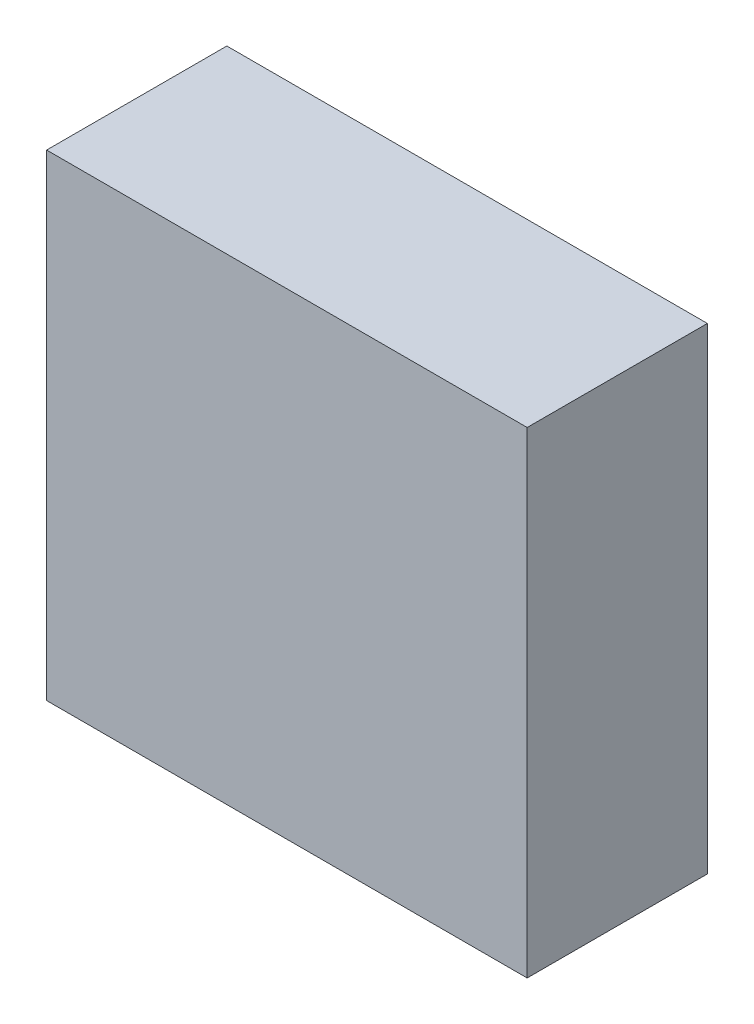
ISO-10303-21;
HEADER;
FILE_DESCRIPTION(('STEP AP214'),'2;1');
FILE_NAME('part.step','',(''),(''),'','','');
FILE_SCHEMA(('AUTOMOTIVE_DESIGN { 1 0 10303 214 1 1 1 1 }'));
ENDSEC;
DATA;
#1=APPLICATION_CONTEXT('core data for automotive mechanical design processes');
#2=APPLICATION_PROTOCOL_DEFINITION('international standard','automotive_design',2000,#1);
#3=PRODUCT_CONTEXT('',#1,'mechanical');
#4=PRODUCT('Part','Part','',(#3));
#5=PRODUCT_RELATED_PRODUCT_CATEGORY('part','',(#4));
#6=PRODUCT_DEFINITION_FORMATION('','',#4);
#7=PRODUCT_DEFINITION_CONTEXT('part definition',#1,'design');
#8=PRODUCT_DEFINITION('design','',#6,#7);
#9=PRODUCT_DEFINITION_SHAPE('','',#8);
#10=(LENGTH_UNIT() NAMED_UNIT(*) SI_UNIT(.MILLI.,.METRE.));
#11=(NAMED_UNIT(*) PLANE_ANGLE_UNIT() SI_UNIT($,.RADIAN.));
#12=(NAMED_UNIT(*) SI_UNIT($,.STERADIAN.) SOLID_ANGLE_UNIT());
#13=UNCERTAINTY_MEASURE_WITH_UNIT(LENGTH_MEASURE(1.E-05),#10,'distance_accuracy_value','');
#14=(GEOMETRIC_REPRESENTATION_CONTEXT(3) GLOBAL_UNCERTAINTY_ASSIGNED_CONTEXT((#13)) GLOBAL_UNIT_ASSIGNED_CONTEXT((#10,
#11,#12)) REPRESENTATION_CONTEXT('',''));
#15=CARTESIAN_POINT('',(0.,0.,0.));
#16=DIRECTION('',(0.,0.,1.));
#17=DIRECTION('',(1.,0.,0.));
#18=AXIS2_PLACEMENT_3D('',#15,#16,#17);
#19=CARTESIAN_POINT('',(64.,63.5,48.));
#20=DIRECTION('',(-1.,0.,0.));
#21=DIRECTION('',(0.,-1.,0.));
#22=AXIS2_PLACEMENT_3D('',#19,#20,#21);
#23=PLANE('',#22);
#24=DIRECTION('',(0.,1.,0.));
#25=VECTOR('',#24,1.);
#26=CARTESIAN_POINT('',(64.,63.5,0.));
#27=LINE('',#26,#25);
#28=CARTESIAN_POINT('',(64.,-63.5,0.));
#29=VERTEX_POINT('',#28);
#30=CARTESIAN_POINT('',(64.,63.5,0.));
#31=VERTEX_POINT('',#30);
#32=EDGE_CURVE('E111',#29,#31,#27,.T.);
#33=ORIENTED_EDGE('',*,*,#32,.T.);
#34=DIRECTION('',(0.,0.,-1.));
#35=VECTOR('',#34,1.);
#36=CARTESIAN_POINT('',(64.,63.5,48.));
#37=LINE('',#36,#35);
#38=CARTESIAN_POINT('',(64.,63.5,48.));
#39=VERTEX_POINT('',#38);
#40=EDGE_CURVE('E11',#39,#31,#37,.T.);
#41=ORIENTED_EDGE('',*,*,#40,.F.);
#42=DIRECTION('',(0.,1.,0.));
#43=VECTOR('',#42,1.);
#44=CARTESIAN_POINT('',(64.,63.5,48.));
#45=LINE('',#44,#43);
#46=CARTESIAN_POINT('',(64.,-63.5,48.));
#47=VERTEX_POINT('',#46);
#48=EDGE_CURVE('E95',#47,#39,#45,.T.);
#49=ORIENTED_EDGE('',*,*,#48,.F.);
#50=DIRECTION('',(0.,0.,-1.));
#51=VECTOR('',#50,1.);
#52=CARTESIAN_POINT('',(64.,-63.5,48.));
#53=LINE('',#52,#51);
#54=EDGE_CURVE('E107',#47,#29,#53,.T.);
#55=ORIENTED_EDGE('',*,*,#54,.T.);
#56=EDGE_LOOP('',(#33,#41,#49,#55));
#57=FACE_BOUND('',#56,.T.);
#58=ADVANCED_FACE('F43',(#57),#23,.F.);
#59=CARTESIAN_POINT('',(-64.,63.5,48.));
#60=DIRECTION('',(0.,-1.,0.));
#61=DIRECTION('',(0.,0.,-1.));
#62=AXIS2_PLACEMENT_3D('',#59,#60,#61);
#63=PLANE('',#62);
#64=DIRECTION('',(-1.,0.,0.));
#65=VECTOR('',#64,1.);
#66=CARTESIAN_POINT('',(-64.,63.5,0.));
#67=LINE('',#66,#65);
#68=CARTESIAN_POINT('',(-64.,63.5,0.));
#69=VERTEX_POINT('',#68);
#70=EDGE_CURVE('E100',#31,#69,#67,.T.);
#71=ORIENTED_EDGE('',*,*,#70,.T.);
#72=DIRECTION('',(0.,0.,-1.));
#73=VECTOR('',#72,1.);
#74=CARTESIAN_POINT('',(-64.,63.5,48.));
#75=LINE('',#74,#73);
#76=CARTESIAN_POINT('',(-64.,63.5,48.));
#77=VERTEX_POINT('',#76);
#78=EDGE_CURVE('E52',#77,#69,#75,.T.);
#79=ORIENTED_EDGE('',*,*,#78,.F.);
#80=DIRECTION('',(-1.,0.,0.));
#81=VECTOR('',#80,1.);
#82=CARTESIAN_POINT('',(-64.,63.5,48.));
#83=LINE('',#82,#81);
#84=EDGE_CURVE('E90',#39,#77,#83,.T.);
#85=ORIENTED_EDGE('',*,*,#84,.F.);
#86=ORIENTED_EDGE('',*,*,#40,.T.);
#87=EDGE_LOOP('',(#71,#79,#85,#86));
#88=FACE_BOUND('',#87,.T.);
#89=ADVANCED_FACE('F99',(#88),#63,.F.);
#90=CARTESIAN_POINT('',(-64.,63.5,48.));
#91=DIRECTION('',(1.,0.,0.));
#92=DIRECTION('',(0.,1.,0.));
#93=AXIS2_PLACEMENT_3D('',#90,#91,#92);
#94=PLANE('',#93);
#95=DIRECTION('',(0.,-1.,0.));
#96=VECTOR('',#95,1.);
#97=CARTESIAN_POINT('',(-64.,63.5,0.));
#98=LINE('',#97,#96);
#99=CARTESIAN_POINT('',(-64.,-63.5,0.));
#100=VERTEX_POINT('',#99);
#101=EDGE_CURVE('E77',#69,#100,#98,.T.);
#102=ORIENTED_EDGE('',*,*,#101,.T.);
#103=DIRECTION('',(0.,0.,-1.));
#104=VECTOR('',#103,1.);
#105=CARTESIAN_POINT('',(-64.,-63.5,48.));
#106=LINE('',#105,#104);
#107=CARTESIAN_POINT('',(-64.,-63.5,48.));
#108=VERTEX_POINT('',#107);
#109=EDGE_CURVE('E102',#108,#100,#106,.T.);
#110=ORIENTED_EDGE('',*,*,#109,.F.);
#111=DIRECTION('',(0.,-1.,0.));
#112=VECTOR('',#111,1.);
#113=CARTESIAN_POINT('',(-64.,63.5,48.));
#114=LINE('',#113,#112);
#115=EDGE_CURVE('E93',#77,#108,#114,.T.);
#116=ORIENTED_EDGE('',*,*,#115,.F.);
#117=ORIENTED_EDGE('',*,*,#78,.T.);
#118=EDGE_LOOP('',(#102,#110,#116,#117));
#119=FACE_BOUND('',#118,.T.);
#120=ADVANCED_FACE('F103',(#119),#94,.F.);
#121=CARTESIAN_POINT('',(-64.,-63.5,48.));
#122=DIRECTION('',(0.,1.,0.));
#123=DIRECTION('',(0.,0.,1.));
#124=AXIS2_PLACEMENT_3D('',#121,#122,#123);
#125=PLANE('',#124);
#126=DIRECTION('',(1.,0.,0.));
#127=VECTOR('',#126,1.);
#128=CARTESIAN_POINT('',(-64.,-63.5,0.));
#129=LINE('',#128,#127);
#130=EDGE_CURVE('E83',#100,#29,#129,.T.);
#131=ORIENTED_EDGE('',*,*,#130,.T.);
#132=ORIENTED_EDGE('',*,*,#54,.F.);
#133=DIRECTION('',(1.,0.,0.));
#134=VECTOR('',#133,1.);
#135=CARTESIAN_POINT('',(-64.,-63.5,48.));
#136=LINE('',#135,#134);
#137=EDGE_CURVE('E60',#108,#47,#136,.T.);
#138=ORIENTED_EDGE('',*,*,#137,.F.);
#139=ORIENTED_EDGE('',*,*,#109,.T.);
#140=EDGE_LOOP('',(#131,#132,#138,#139));
#141=FACE_BOUND('',#140,.T.);
#142=ADVANCED_FACE('F124',(#141),#125,.F.);
#143=CARTESIAN_POINT('',(0.,0.,48.));
#144=DIRECTION('',(0.,0.,1.));
#145=DIRECTION('',(1.,0.,0.));
#146=AXIS2_PLACEMENT_3D('',#143,#144,#145);
#147=PLANE('',#146);
#148=ORIENTED_EDGE('',*,*,#48,.T.);
#149=ORIENTED_EDGE('',*,*,#84,.T.);
#150=ORIENTED_EDGE('',*,*,#115,.T.);
#151=ORIENTED_EDGE('',*,*,#137,.T.);
#152=EDGE_LOOP('',(#148,#149,#150,#151));
#153=FACE_BOUND('',#152,.T.);
#154=ADVANCED_FACE('F91',(#153),#147,.T.);
#155=CARTESIAN_POINT('',(0.,0.,0.));
#156=DIRECTION('',(0.,0.,1.));
#157=DIRECTION('',(1.,0.,0.));
#158=AXIS2_PLACEMENT_3D('',#155,#156,#157);
#159=PLANE('',#158);
#160=ORIENTED_EDGE('',*,*,#32,.F.);
#161=ORIENTED_EDGE('',*,*,#130,.F.);
#162=ORIENTED_EDGE('',*,*,#101,.F.);
#163=ORIENTED_EDGE('',*,*,#70,.F.);
#164=EDGE_LOOP('',(#160,#161,#162,#163));
#165=FACE_BOUND('',#164,.T.);
#166=ADVANCED_FACE('F127',(#165),#159,.F.);
#167=CLOSED_SHELL('',(#58,#89,#120,#142,#154,#166));
#168=MANIFOLD_SOLID_BREP('B2',#167);
#169=ADVANCED_BREP_SHAPE_REPRESENTATION('',(#18,#168),#14);
#170=SHAPE_DEFINITION_REPRESENTATION(#9,#169);
ENDSEC;
END-ISO-10303-21;
